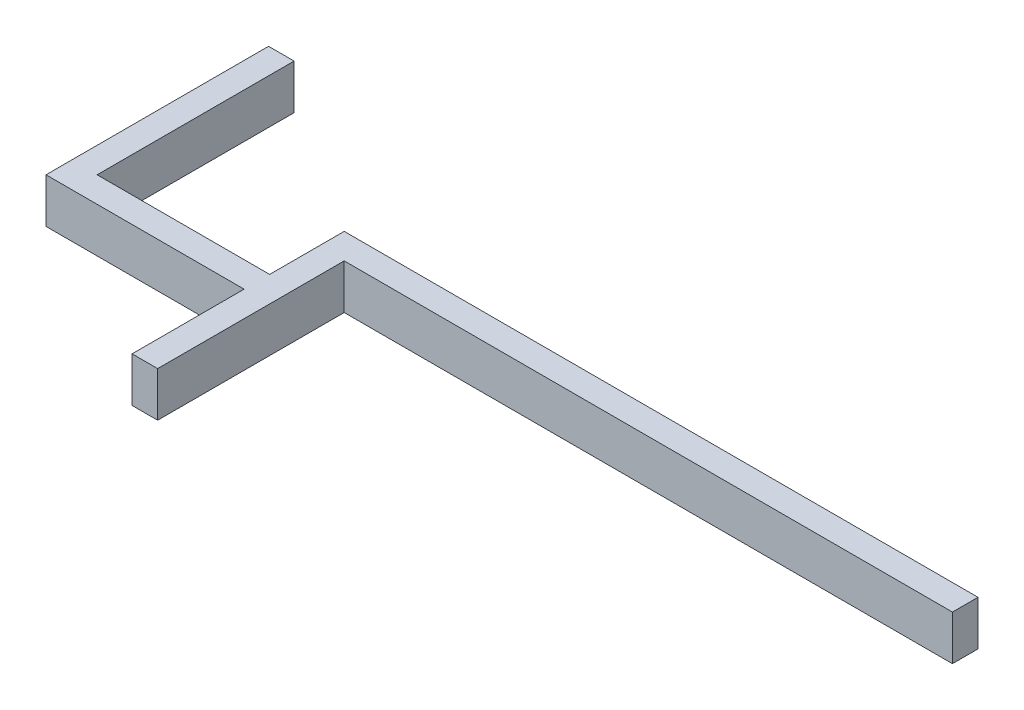
ISO-10303-21;
HEADER;
FILE_DESCRIPTION(('STEP AP214'),'2;1');
FILE_NAME('part.step','',(''),(''),'','','');
FILE_SCHEMA(('AUTOMOTIVE_DESIGN { 1 0 10303 214 1 1 1 1 }'));
ENDSEC;
DATA;
#1=APPLICATION_CONTEXT('core data for automotive mechanical design processes');
#2=APPLICATION_PROTOCOL_DEFINITION('international standard','automotive_design',2000,#1);
#3=PRODUCT_CONTEXT('',#1,'mechanical');
#4=PRODUCT('Part','Part','',(#3));
#5=PRODUCT_RELATED_PRODUCT_CATEGORY('part','',(#4));
#6=PRODUCT_DEFINITION_FORMATION('','',#4);
#7=PRODUCT_DEFINITION_CONTEXT('part definition',#1,'design');
#8=PRODUCT_DEFINITION('design','',#6,#7);
#9=PRODUCT_DEFINITION_SHAPE('','',#8);
#10=(LENGTH_UNIT() NAMED_UNIT(*) SI_UNIT(.MILLI.,.METRE.));
#11=(NAMED_UNIT(*) PLANE_ANGLE_UNIT() SI_UNIT($,.RADIAN.));
#12=(NAMED_UNIT(*) SI_UNIT($,.STERADIAN.) SOLID_ANGLE_UNIT());
#13=UNCERTAINTY_MEASURE_WITH_UNIT(LENGTH_MEASURE(1.E-05),#10,'distance_accuracy_value','');
#14=(GEOMETRIC_REPRESENTATION_CONTEXT(3) GLOBAL_UNCERTAINTY_ASSIGNED_CONTEXT((#13)) GLOBAL_UNIT_ASSIGNED_CONTEXT((#10,
#11,#12)) REPRESENTATION_CONTEXT('',''));
#15=CARTESIAN_POINT('',(0.,0.,0.));
#16=DIRECTION('',(0.,0.,1.));
#17=DIRECTION('',(1.,0.,0.));
#18=AXIS2_PLACEMENT_3D('',#15,#16,#17);
#19=CARTESIAN_POINT('',(13.8487789820468,8.5,-109.182034885455));
#20=DIRECTION('',(0.,0.,1.));
#21=DIRECTION('',(1.,0.,0.));
#22=AXIS2_PLACEMENT_3D('',#19,#20,#21);
#23=PLANE('',#22);
#24=DIRECTION('',(-1.,0.,0.));
#25=VECTOR('',#24,1.);
#26=CARTESIAN_POINT('',(13.8487789820468,1.5,-109.182034885455));
#27=LINE('',#26,#25);
#28=CARTESIAN_POINT('',(40.8417256928748,1.5,-109.182034885455));
#29=VERTEX_POINT('',#28);
#30=CARTESIAN_POINT('',(13.8487789820468,1.5,-109.182034885455));
#31=VERTEX_POINT('',#30);
#32=EDGE_CURVE('E214',#29,#31,#27,.T.);
#33=ORIENTED_EDGE('',*,*,#32,.T.);
#34=DIRECTION('',(0.,-1.,0.));
#35=VECTOR('',#34,1.);
#36=CARTESIAN_POINT('',(13.8487789820468,8.5,-109.182034885455));
#37=LINE('',#36,#35);
#38=CARTESIAN_POINT('',(13.8487789820468,8.5,-109.182034885455));
#39=VERTEX_POINT('',#38);
#40=EDGE_CURVE('E176',#39,#31,#37,.T.);
#41=ORIENTED_EDGE('',*,*,#40,.F.);
#42=DIRECTION('',(-1.,0.,0.));
#43=VECTOR('',#42,1.);
#44=CARTESIAN_POINT('',(13.8487789820468,8.5,-109.182034885455));
#45=LINE('',#44,#43);
#46=CARTESIAN_POINT('',(40.8417256928748,8.5,-109.182034885455));
#47=VERTEX_POINT('',#46);
#48=EDGE_CURVE('E195',#47,#39,#45,.T.);
#49=ORIENTED_EDGE('',*,*,#48,.F.);
#50=DIRECTION('',(0.,-1.,0.));
#51=VECTOR('',#50,1.);
#52=CARTESIAN_POINT('',(40.8417256928748,8.5,-109.182034885455));
#53=LINE('',#52,#51);
#54=EDGE_CURVE('E179',#47,#29,#53,.T.);
#55=ORIENTED_EDGE('',*,*,#54,.T.);
#56=EDGE_LOOP('',(#33,#41,#49,#55));
#57=FACE_BOUND('',#56,.T.);
#58=ADVANCED_FACE('F45',(#57),#23,.F.);
#59=CARTESIAN_POINT('',(40.8417256928748,8.5,-109.182034885455));
#60=DIRECTION('',(1.,0.,0.));
#61=DIRECTION('',(0.,0.,-1.));
#62=AXIS2_PLACEMENT_3D('',#59,#60,#61);
#63=PLANE('',#62);
#64=DIRECTION('',(0.,0.,1.));
#65=VECTOR('',#64,1.);
#66=CARTESIAN_POINT('',(40.8417256928748,1.5,-109.182034885455));
#67=LINE('',#66,#65);
#68=CARTESIAN_POINT('',(40.8417256928748,1.5,-120.845058218164));
#69=VERTEX_POINT('',#68);
#70=EDGE_CURVE('E211',#69,#29,#67,.T.);
#71=ORIENTED_EDGE('',*,*,#70,.T.);
#72=ORIENTED_EDGE('',*,*,#54,.F.);
#73=DIRECTION('',(0.,0.,1.));
#74=VECTOR('',#73,1.);
#75=CARTESIAN_POINT('',(40.8417256928748,8.5,-109.182034885455));
#76=LINE('',#75,#74);
#77=CARTESIAN_POINT('',(40.8417256928748,8.5,-120.845058218164));
#78=VERTEX_POINT('',#77);
#79=EDGE_CURVE('E189',#78,#47,#76,.T.);
#80=ORIENTED_EDGE('',*,*,#79,.F.);
#81=DIRECTION('',(0.,-1.,0.));
#82=VECTOR('',#81,1.);
#83=CARTESIAN_POINT('',(40.8417256928748,8.5,-120.845058218164));
#84=LINE('',#83,#82);
#85=EDGE_CURVE('E182',#78,#69,#84,.T.);
#86=ORIENTED_EDGE('',*,*,#85,.T.);
#87=EDGE_LOOP('',(#71,#72,#80,#86));
#88=FACE_BOUND('',#87,.T.);
#89=ADVANCED_FACE('F263',(#88),#63,.F.);
#90=CARTESIAN_POINT('',(40.8417256928748,8.5,-105.182034885455));
#91=DIRECTION('',(0.,0.,-1.));
#92=DIRECTION('',(-1.,0.,0.));
#93=AXIS2_PLACEMENT_3D('',#90,#91,#92);
#94=PLANE('',#93);
#95=DIRECTION('',(1.,0.,0.));
#96=VECTOR('',#95,1.);
#97=CARTESIAN_POINT('',(40.8417256928748,1.5,-105.182034885455));
#98=LINE('',#97,#96);
#99=CARTESIAN_POINT('',(9.84877898204683,1.5,-105.182034885455));
#100=VERTEX_POINT('',#99);
#101=CARTESIAN_POINT('',(40.8417256928748,1.5,-105.182034885455));
#102=VERTEX_POINT('',#101);
#103=EDGE_CURVE('E223',#100,#102,#98,.T.);
#104=ORIENTED_EDGE('',*,*,#103,.T.);
#105=DIRECTION('',(0.,-1.,0.));
#106=VECTOR('',#105,1.);
#107=CARTESIAN_POINT('',(40.8417256928748,8.5,-105.182034885455));
#108=LINE('',#107,#106);
#109=CARTESIAN_POINT('',(40.8417256928748,8.5,-105.182034885455));
#110=VERTEX_POINT('',#109);
#111=EDGE_CURVE('E164',#110,#102,#108,.T.);
#112=ORIENTED_EDGE('',*,*,#111,.F.);
#113=DIRECTION('',(1.,0.,0.));
#114=VECTOR('',#113,1.);
#115=CARTESIAN_POINT('',(40.8417256928748,8.5,-105.182034885455));
#116=LINE('',#115,#114);
#117=CARTESIAN_POINT('',(9.84877898204683,8.5,-105.182034885455));
#118=VERTEX_POINT('',#117);
#119=EDGE_CURVE('E203',#118,#110,#116,.T.);
#120=ORIENTED_EDGE('',*,*,#119,.F.);
#121=DIRECTION('',(0.,-1.,0.));
#122=VECTOR('',#121,1.);
#123=CARTESIAN_POINT('',(9.84877898204683,8.5,-105.182034885455));
#124=LINE('',#123,#122);
#125=EDGE_CURVE('E167',#118,#100,#124,.T.);
#126=ORIENTED_EDGE('',*,*,#125,.T.);
#127=EDGE_LOOP('',(#104,#112,#120,#126));
#128=FACE_BOUND('',#127,.T.);
#129=ADVANCED_FACE('F245',(#128),#94,.F.);
#130=CARTESIAN_POINT('',(40.8417256928748,8.5,-87.6565730204079));
#131=DIRECTION('',(1.,0.,0.));
#132=DIRECTION('',(0.,0.,-1.));
#133=AXIS2_PLACEMENT_3D('',#130,#131,#132);
#134=PLANE('',#133);
#135=DIRECTION('',(0.,0.,1.));
#136=VECTOR('',#135,1.);
#137=CARTESIAN_POINT('',(40.8417256928748,1.5,-87.6565730204079));
#138=LINE('',#137,#136);
#139=CARTESIAN_POINT('',(40.8417256928748,1.5,-87.6565730204079));
#140=VERTEX_POINT('',#139);
#141=EDGE_CURVE('E226',#102,#140,#138,.T.);
#142=ORIENTED_EDGE('',*,*,#141,.T.);
#143=DIRECTION('',(0.,-1.,0.));
#144=VECTOR('',#143,1.);
#145=CARTESIAN_POINT('',(40.8417256928748,8.5,-87.6565730204079));
#146=LINE('',#145,#144);
#147=CARTESIAN_POINT('',(40.8417256928748,8.5,-87.6565730204079));
#148=VERTEX_POINT('',#147);
#149=EDGE_CURVE('E161',#148,#140,#146,.T.);
#150=ORIENTED_EDGE('',*,*,#149,.F.);
#151=DIRECTION('',(0.,0.,1.));
#152=VECTOR('',#151,1.);
#153=CARTESIAN_POINT('',(40.8417256928748,8.5,-87.6565730204079));
#154=LINE('',#153,#152);
#155=EDGE_CURVE('E205',#110,#148,#154,.T.);
#156=ORIENTED_EDGE('',*,*,#155,.F.);
#157=ORIENTED_EDGE('',*,*,#111,.T.);
#158=EDGE_LOOP('',(#142,#150,#156,#157));
#159=FACE_BOUND('',#158,.T.);
#160=ADVANCED_FACE('F241',(#159),#134,.F.);
#161=CARTESIAN_POINT('',(44.8417256928748,8.5,-87.6565730204079));
#162=DIRECTION('',(0.,0.,-1.));
#163=DIRECTION('',(-1.,0.,0.));
#164=AXIS2_PLACEMENT_3D('',#161,#162,#163);
#165=PLANE('',#164);
#166=DIRECTION('',(1.,0.,0.));
#167=VECTOR('',#166,1.);
#168=CARTESIAN_POINT('',(44.8417256928748,1.5,-87.6565730204079));
#169=LINE('',#168,#167);
#170=CARTESIAN_POINT('',(44.8417256928748,1.5,-87.6565730204079));
#171=VERTEX_POINT('',#170);
#172=EDGE_CURVE('E229',#140,#171,#169,.T.);
#173=ORIENTED_EDGE('',*,*,#172,.T.);
#174=DIRECTION('',(0.,-1.,0.));
#175=VECTOR('',#174,1.);
#176=CARTESIAN_POINT('',(44.8417256928748,8.5,-87.6565730204079));
#177=LINE('',#176,#175);
#178=CARTESIAN_POINT('',(44.8417256928748,8.5,-87.6565730204079));
#179=VERTEX_POINT('',#178);
#180=EDGE_CURVE('E153',#179,#171,#177,.T.);
#181=ORIENTED_EDGE('',*,*,#180,.F.);
#182=DIRECTION('',(1.,0.,0.));
#183=VECTOR('',#182,1.);
#184=CARTESIAN_POINT('',(44.8417256928748,8.5,-87.6565730204079));
#185=LINE('',#184,#183);
#186=EDGE_CURVE('E207',#148,#179,#185,.T.);
#187=ORIENTED_EDGE('',*,*,#186,.F.);
#188=ORIENTED_EDGE('',*,*,#149,.T.);
#189=EDGE_LOOP('',(#173,#181,#187,#188));
#190=FACE_BOUND('',#189,.T.);
#191=ADVANCED_FACE('F236',(#190),#165,.F.);
#192=CARTESIAN_POINT('',(44.8417256928748,8.5,-116.845058218164));
#193=DIRECTION('',(-1.,0.,0.));
#194=DIRECTION('',(0.,0.,1.));
#195=AXIS2_PLACEMENT_3D('',#192,#193,#194);
#196=PLANE('',#195);
#197=DIRECTION('',(0.,0.,-1.));
#198=VECTOR('',#197,1.);
#199=CARTESIAN_POINT('',(44.8417256928748,1.5,-116.845058218164));
#200=LINE('',#199,#198);
#201=CARTESIAN_POINT('',(44.8417256928748,1.5,-116.845058218164));
#202=VERTEX_POINT('',#201);
#203=EDGE_CURVE('E149',#171,#202,#200,.T.);
#204=ORIENTED_EDGE('',*,*,#203,.T.);
#205=DIRECTION('',(0.,-1.,0.));
#206=VECTOR('',#205,1.);
#207=CARTESIAN_POINT('',(44.8417256928748,8.5,-116.845058218164));
#208=LINE('',#207,#206);
#209=CARTESIAN_POINT('',(44.8417256928748,8.5,-116.845058218164));
#210=VERTEX_POINT('',#209);
#211=EDGE_CURVE('E147',#210,#202,#208,.T.);
#212=ORIENTED_EDGE('',*,*,#211,.F.);
#213=DIRECTION('',(0.,0.,-1.));
#214=VECTOR('',#213,1.);
#215=CARTESIAN_POINT('',(44.8417256928748,8.5,-116.845058218164));
#216=LINE('',#215,#214);
#217=EDGE_CURVE('E155',#179,#210,#216,.T.);
#218=ORIENTED_EDGE('',*,*,#217,.F.);
#219=ORIENTED_EDGE('',*,*,#180,.T.);
#220=EDGE_LOOP('',(#204,#212,#218,#219));
#221=FACE_BOUND('',#220,.T.);
#222=ADVANCED_FACE('F232',(#221),#196,.F.);
#223=CARTESIAN_POINT('',(140.,8.5,-116.845058218164));
#224=DIRECTION('',(0.,0.,-1.));
#225=DIRECTION('',(-1.,0.,0.));
#226=AXIS2_PLACEMENT_3D('',#223,#224,#225);
#227=PLANE('',#226);
#228=DIRECTION('',(1.,0.,0.));
#229=VECTOR('',#228,1.);
#230=CARTESIAN_POINT('',(140.,1.5,-116.845058218164));
#231=LINE('',#230,#229);
#232=CARTESIAN_POINT('',(140.,1.5,-116.845058218164));
#233=VERTEX_POINT('',#232);
#234=EDGE_CURVE('E132',#202,#233,#231,.T.);
#235=ORIENTED_EDGE('',*,*,#234,.T.);
#236=DIRECTION('',(0.,-1.,0.));
#237=VECTOR('',#236,1.);
#238=CARTESIAN_POINT('',(140.,8.5,-116.845058218164));
#239=LINE('',#238,#237);
#240=CARTESIAN_POINT('',(140.,8.5,-116.845058218164));
#241=VERTEX_POINT('',#240);
#242=EDGE_CURVE('E144',#241,#233,#239,.T.);
#243=ORIENTED_EDGE('',*,*,#242,.F.);
#244=DIRECTION('',(1.,0.,0.));
#245=VECTOR('',#244,1.);
#246=CARTESIAN_POINT('',(140.,8.5,-116.845058218164));
#247=LINE('',#246,#245);
#248=EDGE_CURVE('E61',#210,#241,#247,.T.);
#249=ORIENTED_EDGE('',*,*,#248,.F.);
#250=ORIENTED_EDGE('',*,*,#211,.T.);
#251=EDGE_LOOP('',(#235,#243,#249,#250));
#252=FACE_BOUND('',#251,.T.);
#253=ADVANCED_FACE('F143',(#252),#227,.F.);
#254=CARTESIAN_POINT('',(40.8417256928748,8.5,-120.845058218164));
#255=DIRECTION('',(0.,0.,1.));
#256=DIRECTION('',(1.,0.,0.));
#257=AXIS2_PLACEMENT_3D('',#254,#255,#256);
#258=PLANE('',#257);
#259=DIRECTION('',(-1.,0.,0.));
#260=VECTOR('',#259,1.);
#261=CARTESIAN_POINT('',(40.8417256928748,1.5,-120.845058218164));
#262=LINE('',#261,#260);
#263=CARTESIAN_POINT('',(140.,1.5,-120.845058218164));
#264=VERTEX_POINT('',#263);
#265=EDGE_CURVE('E135',#264,#69,#262,.T.);
#266=ORIENTED_EDGE('',*,*,#265,.T.);
#267=ORIENTED_EDGE('',*,*,#85,.F.);
#268=DIRECTION('',(-1.,0.,0.));
#269=VECTOR('',#268,1.);
#270=CARTESIAN_POINT('',(40.8417256928748,8.5,-120.845058218164));
#271=LINE('',#270,#269);
#272=CARTESIAN_POINT('',(140.,8.5,-120.845058218164));
#273=VERTEX_POINT('',#272);
#274=EDGE_CURVE('E187',#273,#78,#271,.T.);
#275=ORIENTED_EDGE('',*,*,#274,.F.);
#276=DIRECTION('',(0.,-1.,0.));
#277=VECTOR('',#276,1.);
#278=CARTESIAN_POINT('',(140.,8.5,-120.845058218164));
#279=LINE('',#278,#277);
#280=EDGE_CURVE('E54',#273,#264,#279,.T.);
#281=ORIENTED_EDGE('',*,*,#280,.T.);
#282=EDGE_LOOP('',(#266,#267,#275,#281));
#283=FACE_BOUND('',#282,.T.);
#284=ADVANCED_FACE('F185',(#283),#258,.F.);
#285=CARTESIAN_POINT('',(140.,1.5,140.));
#286=DIRECTION('',(-1.,0.,0.));
#287=DIRECTION('',(0.,0.,1.));
#288=AXIS2_PLACEMENT_3D('',#285,#286,#287);
#289=PLANE('',#288);
#290=ORIENTED_EDGE('',*,*,#242,.T.);
#291=DIRECTION('',(0.,0.,-1.));
#292=VECTOR('',#291,1.);
#293=CARTESIAN_POINT('',(140.,1.5,48.5023780265679));
#294=LINE('',#293,#292);
#295=EDGE_CURVE('E129',#233,#264,#294,.T.);
#296=ORIENTED_EDGE('',*,*,#295,.T.);
#297=ORIENTED_EDGE('',*,*,#280,.F.);
#298=DIRECTION('',(0.,0.,-1.));
#299=VECTOR('',#298,1.);
#300=CARTESIAN_POINT('',(140.,8.5,-120.845058218164));
#301=LINE('',#300,#299);
#302=EDGE_CURVE('E148',#241,#273,#301,.T.);
#303=ORIENTED_EDGE('',*,*,#302,.F.);
#304=EDGE_LOOP('',(#290,#296,#297,#303));
#305=FACE_BOUND('',#304,.T.);
#306=ADVANCED_FACE('F151',(#305),#289,.F.);
#307=CARTESIAN_POINT('',(13.8487789820468,8.5,-140.));
#308=DIRECTION('',(-1.,0.,0.));
#309=DIRECTION('',(0.,0.,1.));
#310=AXIS2_PLACEMENT_3D('',#307,#308,#309);
#311=PLANE('',#310);
#312=DIRECTION('',(0.,0.,-1.));
#313=VECTOR('',#312,1.);
#314=CARTESIAN_POINT('',(13.8487789820468,1.5,-140.));
#315=LINE('',#314,#313);
#316=CARTESIAN_POINT('',(13.8487789820468,1.5,-140.));
#317=VERTEX_POINT('',#316);
#318=EDGE_CURVE('E217',#31,#317,#315,.T.);
#319=ORIENTED_EDGE('',*,*,#318,.T.);
#320=DIRECTION('',(0.,-1.,0.));
#321=VECTOR('',#320,1.);
#322=CARTESIAN_POINT('',(13.8487789820468,8.5,-140.));
#323=LINE('',#322,#321);
#324=CARTESIAN_POINT('',(13.8487789820468,8.5,-140.));
#325=VERTEX_POINT('',#324);
#326=EDGE_CURVE('E173',#325,#317,#323,.T.);
#327=ORIENTED_EDGE('',*,*,#326,.F.);
#328=DIRECTION('',(0.,0.,-1.));
#329=VECTOR('',#328,1.);
#330=CARTESIAN_POINT('',(13.8487789820468,8.5,-140.));
#331=LINE('',#330,#329);
#332=EDGE_CURVE('E197',#39,#325,#331,.T.);
#333=ORIENTED_EDGE('',*,*,#332,.F.);
#334=ORIENTED_EDGE('',*,*,#40,.T.);
#335=EDGE_LOOP('',(#319,#327,#333,#334));
#336=FACE_BOUND('',#335,.T.);
#337=ADVANCED_FACE('F257',(#336),#311,.F.);
#338=CARTESIAN_POINT('',(0.,8.5,0.));
#339=DIRECTION('',(0.,-1.,0.));
#340=DIRECTION('',(0.,0.,-1.));
#341=AXIS2_PLACEMENT_3D('',#338,#339,#340);
#342=PLANE('',#341);
#343=ORIENTED_EDGE('',*,*,#302,.T.);
#344=ORIENTED_EDGE('',*,*,#274,.T.);
#345=ORIENTED_EDGE('',*,*,#79,.T.);
#346=ORIENTED_EDGE('',*,*,#48,.T.);
#347=ORIENTED_EDGE('',*,*,#332,.T.);
#348=DIRECTION('',(-1.,0.,0.));
#349=VECTOR('',#348,1.);
#350=CARTESIAN_POINT('',(9.84877898204683,8.5,-140.));
#351=LINE('',#350,#349);
#352=CARTESIAN_POINT('',(9.84877898204683,8.5,-140.));
#353=VERTEX_POINT('',#352);
#354=EDGE_CURVE('E199',#325,#353,#351,.T.);
#355=ORIENTED_EDGE('',*,*,#354,.T.);
#356=DIRECTION('',(0.,0.,1.));
#357=VECTOR('',#356,1.);
#358=CARTESIAN_POINT('',(9.84877898204683,8.5,-105.182034885455));
#359=LINE('',#358,#357);
#360=EDGE_CURVE('E201',#353,#118,#359,.T.);
#361=ORIENTED_EDGE('',*,*,#360,.T.);
#362=ORIENTED_EDGE('',*,*,#119,.T.);
#363=ORIENTED_EDGE('',*,*,#155,.T.);
#364=ORIENTED_EDGE('',*,*,#186,.T.);
#365=ORIENTED_EDGE('',*,*,#217,.T.);
#366=ORIENTED_EDGE('',*,*,#248,.T.);
#367=EDGE_LOOP('',(#343,#344,#345,#346,#347,#355,#361,#362,#363,#364,#365,#366));
#368=FACE_BOUND('',#367,.T.);
#369=ADVANCED_FACE('F191',(#368),#342,.F.);
#370=CARTESIAN_POINT('',(9.84877898204683,8.5,-105.182034885455));
#371=DIRECTION('',(1.,0.,0.));
#372=DIRECTION('',(0.,0.,-1.));
#373=AXIS2_PLACEMENT_3D('',#370,#371,#372);
#374=PLANE('',#373);
#375=DIRECTION('',(0.,0.,1.));
#376=VECTOR('',#375,1.);
#377=CARTESIAN_POINT('',(9.84877898204683,1.5,-105.182034885455));
#378=LINE('',#377,#376);
#379=CARTESIAN_POINT('',(9.84877898204683,1.5,-140.));
#380=VERTEX_POINT('',#379);
#381=EDGE_CURVE('E220',#380,#100,#378,.T.);
#382=ORIENTED_EDGE('',*,*,#381,.T.);
#383=ORIENTED_EDGE('',*,*,#125,.F.);
#384=ORIENTED_EDGE('',*,*,#360,.F.);
#385=DIRECTION('',(0.,-1.,0.));
#386=VECTOR('',#385,1.);
#387=CARTESIAN_POINT('',(9.84877898204683,8.5,-140.));
#388=LINE('',#387,#386);
#389=EDGE_CURVE('E170',#353,#380,#388,.T.);
#390=ORIENTED_EDGE('',*,*,#389,.T.);
#391=EDGE_LOOP('',(#382,#383,#384,#390));
#392=FACE_BOUND('',#391,.T.);
#393=ADVANCED_FACE('F250',(#392),#374,.F.);
#394=CARTESIAN_POINT('',(140.,1.5,-140.));
#395=DIRECTION('',(0.,0.,1.));
#396=DIRECTION('',(1.,0.,0.));
#397=AXIS2_PLACEMENT_3D('',#394,#395,#396);
#398=PLANE('',#397);
#399=ORIENTED_EDGE('',*,*,#326,.T.);
#400=DIRECTION('',(-1.,0.,0.));
#401=VECTOR('',#400,1.);
#402=CARTESIAN_POINT('',(140.,1.5,-140.));
#403=LINE('',#402,#401);
#404=EDGE_CURVE('E11',#317,#380,#403,.T.);
#405=ORIENTED_EDGE('',*,*,#404,.T.);
#406=ORIENTED_EDGE('',*,*,#389,.F.);
#407=ORIENTED_EDGE('',*,*,#354,.F.);
#408=EDGE_LOOP('',(#399,#405,#406,#407));
#409=FACE_BOUND('',#408,.T.);
#410=ADVANCED_FACE('F47',(#409),#398,.F.);
#411=CARTESIAN_POINT('',(0.,1.5,48.5023780265679));
#412=DIRECTION('',(0.,1.,0.));
#413=DIRECTION('',(0.,0.,1.));
#414=AXIS2_PLACEMENT_3D('',#411,#412,#413);
#415=PLANE('',#414);
#416=ORIENTED_EDGE('',*,*,#295,.F.);
#417=ORIENTED_EDGE('',*,*,#234,.F.);
#418=ORIENTED_EDGE('',*,*,#203,.F.);
#419=ORIENTED_EDGE('',*,*,#172,.F.);
#420=ORIENTED_EDGE('',*,*,#141,.F.);
#421=ORIENTED_EDGE('',*,*,#103,.F.);
#422=ORIENTED_EDGE('',*,*,#381,.F.);
#423=ORIENTED_EDGE('',*,*,#404,.F.);
#424=ORIENTED_EDGE('',*,*,#318,.F.);
#425=ORIENTED_EDGE('',*,*,#32,.F.);
#426=ORIENTED_EDGE('',*,*,#70,.F.);
#427=ORIENTED_EDGE('',*,*,#265,.F.);
#428=EDGE_LOOP('',(#416,#417,#418,#419,#420,#421,#422,#423,#424,#425,#426,#427));
#429=FACE_BOUND('',#428,.T.);
#430=ADVANCED_FACE('F131',(#429),#415,.F.);
#431=CLOSED_SHELL('',(#58,#89,#129,#160,#191,#222,#253,#284,#306,#337,#369,#393,#410,#430));
#432=MANIFOLD_SOLID_BREP('B2',#431);
#433=ADVANCED_BREP_SHAPE_REPRESENTATION('',(#18,#432),#14);
#434=SHAPE_DEFINITION_REPRESENTATION(#9,#433);
ENDSEC;
END-ISO-10303-21;
